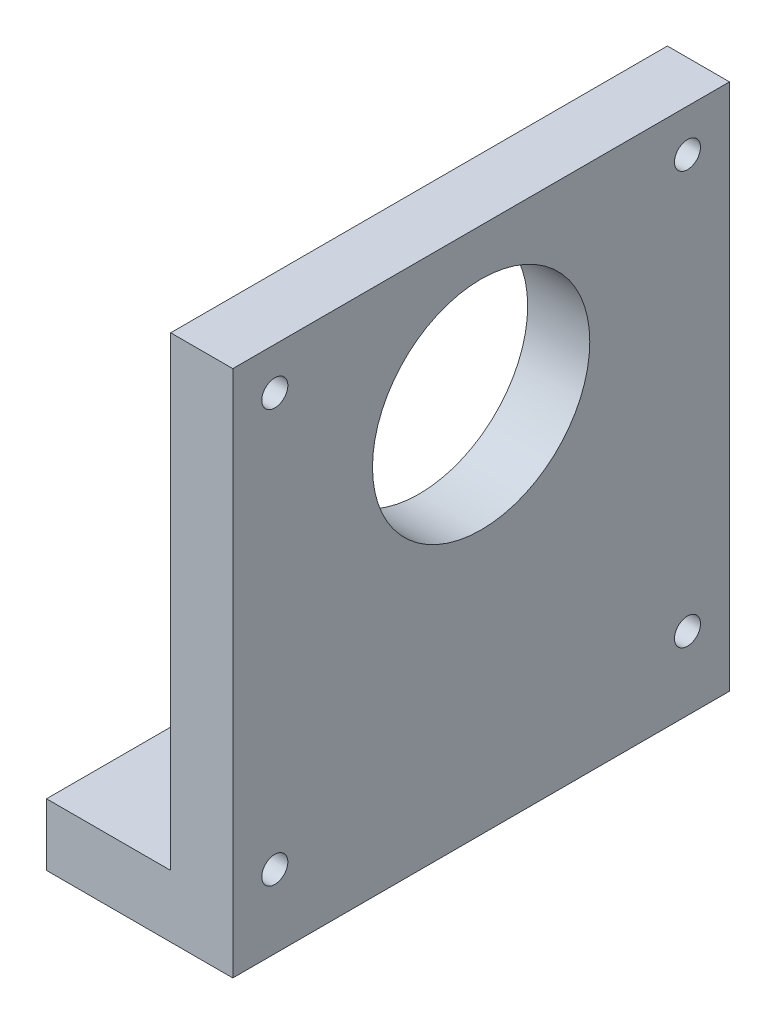
ISO-10303-21;
HEADER;
FILE_DESCRIPTION(('STEP AP214'),'2;1');
FILE_NAME('part.step','',(''),(''),'','','');
FILE_SCHEMA(('AUTOMOTIVE_DESIGN { 1 0 10303 214 1 1 1 1 }'));
ENDSEC;
DATA;
#1=APPLICATION_CONTEXT('core data for automotive mechanical design processes');
#2=APPLICATION_PROTOCOL_DEFINITION('international standard','automotive_design',2000,#1);
#3=PRODUCT_CONTEXT('',#1,'mechanical');
#4=PRODUCT('Part','Part','',(#3));
#5=PRODUCT_RELATED_PRODUCT_CATEGORY('part','',(#4));
#6=PRODUCT_DEFINITION_FORMATION('','',#4);
#7=PRODUCT_DEFINITION_CONTEXT('part definition',#1,'design');
#8=PRODUCT_DEFINITION('design','',#6,#7);
#9=PRODUCT_DEFINITION_SHAPE('','',#8);
#10=(LENGTH_UNIT() NAMED_UNIT(*) SI_UNIT(.MILLI.,.METRE.));
#11=(NAMED_UNIT(*) PLANE_ANGLE_UNIT() SI_UNIT($,.RADIAN.));
#12=(NAMED_UNIT(*) SI_UNIT($,.STERADIAN.) SOLID_ANGLE_UNIT());
#13=UNCERTAINTY_MEASURE_WITH_UNIT(LENGTH_MEASURE(1.E-05),#10,'distance_accuracy_value','');
#14=(GEOMETRIC_REPRESENTATION_CONTEXT(3) GLOBAL_UNCERTAINTY_ASSIGNED_CONTEXT((#13)) GLOBAL_UNIT_ASSIGNED_CONTEXT((#10,
#11,#12)) REPRESENTATION_CONTEXT('',''));
#15=CARTESIAN_POINT('',(0.,0.,0.));
#16=DIRECTION('',(0.,0.,1.));
#17=DIRECTION('',(1.,0.,0.));
#18=AXIS2_PLACEMENT_3D('',#15,#16,#17);
#19=CARTESIAN_POINT('',(0.,10.,40.));
#20=DIRECTION('',(1.,0.,0.));
#21=DIRECTION('',(0.,1.,0.));
#22=AXIS2_PLACEMENT_3D('',#19,#20,#21);
#23=PLANE('',#22);
#24=CARTESIAN_POINT('',(0.,59.9999999999999,0.));
#25=DIRECTION('',(-1.,0.,0.));
#26=DIRECTION('',(0.,-1.,0.));
#27=AXIS2_PLACEMENT_3D('',#24,#25,#26);
#28=CIRCLE('',#27,17.5);
#29=CARTESIAN_POINT('',(0.,42.4999999999999,0.));
#30=VERTEX_POINT('',#29);
#31=EDGE_CURVE('E364',#30,#30,#28,.T.);
#32=ORIENTED_EDGE('',*,*,#31,.F.);
#33=EDGE_LOOP('',(#32));
#34=FACE_BOUND('',#33,.T.);
#35=CARTESIAN_POINT('',(0.,78.2340187157675,33.2340187157679));
#36=DIRECTION('',(-1.,0.,0.));
#37=DIRECTION('',(0.,0.,1.));
#38=AXIS2_PLACEMENT_3D('',#35,#36,#37);
#39=CIRCLE('',#38,2.09999999999999);
#40=CARTESIAN_POINT('',(0.,78.2340187157675,35.3340187157679));
#41=VERTEX_POINT('',#40);
#42=EDGE_CURVE('E360',#41,#41,#39,.T.);
#43=ORIENTED_EDGE('',*,*,#42,.F.);
#44=EDGE_LOOP('',(#43));
#45=FACE_BOUND('',#44,.T.);
#46=CARTESIAN_POINT('',(0.,78.2340187157677,-33.2340187157677));
#47=DIRECTION('',(-1.,0.,0.));
#48=DIRECTION('',(0.,0.,1.));
#49=AXIS2_PLACEMENT_3D('',#46,#47,#48);
#50=CIRCLE('',#49,2.09999999999999);
#51=CARTESIAN_POINT('',(0.,78.2340187157677,-31.1340187157677));
#52=VERTEX_POINT('',#51);
#53=EDGE_CURVE('E354',#52,#52,#50,.T.);
#54=ORIENTED_EDGE('',*,*,#53,.F.);
#55=EDGE_LOOP('',(#54));
#56=FACE_BOUND('',#55,.T.);
#57=DIRECTION('',(0.,0.,-1.));
#58=VECTOR('',#57,1.);
#59=CARTESIAN_POINT('',(0.,10.,40.));
#60=LINE('',#59,#58);
#61=CARTESIAN_POINT('',(0.,10.,-34.3703769795832));
#62=VERTEX_POINT('',#61);
#63=CARTESIAN_POINT('',(0.,10.,-40.));
#64=VERTEX_POINT('',#63);
#65=EDGE_CURVE('E158',#62,#64,#60,.T.);
#66=ORIENTED_EDGE('',*,*,#65,.F.);
#67=CARTESIAN_POINT('',(0.,11.7659812842321,-33.2340187157677));
#68=DIRECTION('',(1.,0.,0.));
#69=DIRECTION('',(0.,1.,0.));
#70=AXIS2_PLACEMENT_3D('',#67,#68,#69);
#71=CIRCLE('',#70,2.09999999999999);
#72=CARTESIAN_POINT('',(0.,10.,-32.0976604519521));
#73=VERTEX_POINT('',#72);
#74=EDGE_CURVE('E11',#62,#73,#71,.T.);
#75=ORIENTED_EDGE('',*,*,#74,.T.);
#76=CARTESIAN_POINT('',(0.,10.,32.0976604519528));
#77=VERTEX_POINT('',#76);
#78=EDGE_CURVE('E169',#77,#73,#60,.T.);
#79=ORIENTED_EDGE('',*,*,#78,.F.);
#80=CARTESIAN_POINT('',(0.,11.7659812842324,33.2340187157679));
#81=DIRECTION('',(-1.,0.,0.));
#82=DIRECTION('',(0.,0.,1.));
#83=AXIS2_PLACEMENT_3D('',#80,#81,#82);
#84=CIRCLE('',#83,2.09999999999999);
#85=CARTESIAN_POINT('',(0.,10.,34.3703769795831));
#86=VERTEX_POINT('',#85);
#87=EDGE_CURVE('E349',#86,#77,#84,.T.);
#88=ORIENTED_EDGE('',*,*,#87,.F.);
#89=CARTESIAN_POINT('',(0.,10.,40.));
#90=VERTEX_POINT('',#89);
#91=EDGE_CURVE('E166',#90,#86,#60,.T.);
#92=ORIENTED_EDGE('',*,*,#91,.F.);
#93=DIRECTION('',(0.,-1.,0.));
#94=VECTOR('',#93,1.);
#95=CARTESIAN_POINT('',(0.,10.,40.));
#96=LINE('',#95,#94);
#97=CARTESIAN_POINT('',(0.,85.,40.));
#98=VERTEX_POINT('',#97);
#99=EDGE_CURVE('E229',#98,#90,#96,.T.);
#100=ORIENTED_EDGE('',*,*,#99,.F.);
#101=DIRECTION('',(0.,0.,-1.));
#102=VECTOR('',#101,1.);
#103=CARTESIAN_POINT('',(0.,85.,40.));
#104=LINE('',#103,#102);
#105=CARTESIAN_POINT('',(0.,85.,-40.));
#106=VERTEX_POINT('',#105);
#107=EDGE_CURVE('E174',#98,#106,#104,.T.);
#108=ORIENTED_EDGE('',*,*,#107,.T.);
#109=DIRECTION('',(0.,-1.,0.));
#110=VECTOR('',#109,1.);
#111=CARTESIAN_POINT('',(0.,10.,-40.));
#112=LINE('',#111,#110);
#113=EDGE_CURVE('E161',#106,#64,#112,.T.);
#114=ORIENTED_EDGE('',*,*,#113,.T.);
#115=EDGE_LOOP('',(#66,#75,#79,#88,#92,#100,#108,#114));
#116=FACE_BOUND('',#115,.T.);
#117=ADVANCED_FACE('F34',(#34,#45,#56,#116),#23,.F.);
#118=CARTESIAN_POINT('',(10.,0.,40.));
#119=DIRECTION('',(-1.,0.,0.));
#120=DIRECTION('',(0.,-1.,0.));
#121=AXIS2_PLACEMENT_3D('',#118,#119,#120);
#122=PLANE('',#121);
#123=CARTESIAN_POINT('',(10.,59.9999999999999,0.));
#124=DIRECTION('',(-1.,0.,0.));
#125=DIRECTION('',(0.,-1.,0.));
#126=AXIS2_PLACEMENT_3D('',#123,#124,#125);
#127=CIRCLE('',#126,17.5);
#128=CARTESIAN_POINT('',(10.,42.4999999999999,0.));
#129=VERTEX_POINT('',#128);
#130=EDGE_CURVE('E363',#129,#129,#127,.T.);
#131=ORIENTED_EDGE('',*,*,#130,.T.);
#132=EDGE_LOOP('',(#131));
#133=FACE_BOUND('',#132,.T.);
#134=CARTESIAN_POINT('',(10.,78.2340187157675,33.2340187157679));
#135=DIRECTION('',(-1.,0.,0.));
#136=DIRECTION('',(0.,-1.,0.));
#137=AXIS2_PLACEMENT_3D('',#134,#135,#136);
#138=CIRCLE('',#137,2.09999999999999);
#139=CARTESIAN_POINT('',(10.,76.1340187157675,33.2340187157679));
#140=VERTEX_POINT('',#139);
#141=EDGE_CURVE('E357',#140,#140,#138,.T.);
#142=ORIENTED_EDGE('',*,*,#141,.T.);
#143=EDGE_LOOP('',(#142));
#144=FACE_BOUND('',#143,.T.);
#145=CARTESIAN_POINT('',(10.,78.2340187157677,-33.2340187157677));
#146=DIRECTION('',(-1.,0.,0.));
#147=DIRECTION('',(0.,-1.,0.));
#148=AXIS2_PLACEMENT_3D('',#145,#146,#147);
#149=CIRCLE('',#148,2.09999999999999);
#150=CARTESIAN_POINT('',(10.,76.1340187157677,-33.2340187157677));
#151=VERTEX_POINT('',#150);
#152=EDGE_CURVE('E155',#151,#151,#149,.T.);
#153=ORIENTED_EDGE('',*,*,#152,.T.);
#154=EDGE_LOOP('',(#153));
#155=FACE_BOUND('',#154,.T.);
#156=CARTESIAN_POINT('',(10.,11.7659812842321,-33.2340187157677));
#157=DIRECTION('',(-1.,0.,0.));
#158=DIRECTION('',(0.,-1.,0.));
#159=AXIS2_PLACEMENT_3D('',#156,#157,#158);
#160=CIRCLE('',#159,2.09999999999999);
#161=CARTESIAN_POINT('',(10.,9.66598128423211,-33.2340187157677));
#162=VERTEX_POINT('',#161);
#163=EDGE_CURVE('E154',#162,#162,#160,.T.);
#164=ORIENTED_EDGE('',*,*,#163,.T.);
#165=EDGE_LOOP('',(#164));
#166=FACE_BOUND('',#165,.T.);
#167=CARTESIAN_POINT('',(10.,11.7659812842324,33.2340187157679));
#168=DIRECTION('',(-1.,0.,0.));
#169=DIRECTION('',(0.,-1.,0.));
#170=AXIS2_PLACEMENT_3D('',#167,#168,#169);
#171=CIRCLE('',#170,2.09999999999999);
#172=CARTESIAN_POINT('',(10.,9.66598128423236,33.2340187157679));
#173=VERTEX_POINT('',#172);
#174=EDGE_CURVE('E345',#173,#173,#171,.T.);
#175=ORIENTED_EDGE('',*,*,#174,.T.);
#176=EDGE_LOOP('',(#175));
#177=FACE_BOUND('',#176,.T.);
#178=DIRECTION('',(0.,1.,0.));
#179=VECTOR('',#178,1.);
#180=CARTESIAN_POINT('',(10.,0.,-40.));
#181=LINE('',#180,#179);
#182=CARTESIAN_POINT('',(10.,0.,-40.));
#183=VERTEX_POINT('',#182);
#184=CARTESIAN_POINT('',(10.,85.,-40.));
#185=VERTEX_POINT('',#184);
#186=EDGE_CURVE('E189',#183,#185,#181,.T.);
#187=ORIENTED_EDGE('',*,*,#186,.T.);
#188=DIRECTION('',(0.,0.,-1.));
#189=VECTOR('',#188,1.);
#190=CARTESIAN_POINT('',(10.,85.,40.));
#191=LINE('',#190,#189);
#192=CARTESIAN_POINT('',(10.,85.,40.));
#193=VERTEX_POINT('',#192);
#194=EDGE_CURVE('E42',#193,#185,#191,.T.);
#195=ORIENTED_EDGE('',*,*,#194,.F.);
#196=DIRECTION('',(0.,1.,0.));
#197=VECTOR('',#196,1.);
#198=CARTESIAN_POINT('',(10.,0.,40.));
#199=LINE('',#198,#197);
#200=CARTESIAN_POINT('',(10.,0.,40.));
#201=VERTEX_POINT('',#200);
#202=EDGE_CURVE('E211',#201,#193,#199,.T.);
#203=ORIENTED_EDGE('',*,*,#202,.F.);
#204=DIRECTION('',(0.,0.,-1.));
#205=VECTOR('',#204,1.);
#206=CARTESIAN_POINT('',(10.,0.,40.));
#207=LINE('',#206,#205);
#208=EDGE_CURVE('E191',#201,#183,#207,.T.);
#209=ORIENTED_EDGE('',*,*,#208,.T.);
#210=EDGE_LOOP('',(#187,#195,#203,#209));
#211=FACE_BOUND('',#210,.T.);
#212=ADVANCED_FACE('F36',(#133,#144,#155,#166,#177,#211),#122,.F.);
#213=CARTESIAN_POINT('',(0.,85.,40.));
#214=DIRECTION('',(0.,-1.,0.));
#215=DIRECTION('',(0.,0.,-1.));
#216=AXIS2_PLACEMENT_3D('',#213,#214,#215);
#217=PLANE('',#216);
#218=DIRECTION('',(-1.,0.,0.));
#219=VECTOR('',#218,1.);
#220=CARTESIAN_POINT('',(0.,85.,-40.));
#221=LINE('',#220,#219);
#222=EDGE_CURVE('E182',#185,#106,#221,.T.);
#223=ORIENTED_EDGE('',*,*,#222,.T.);
#224=ORIENTED_EDGE('',*,*,#107,.F.);
#225=DIRECTION('',(-1.,0.,0.));
#226=VECTOR('',#225,1.);
#227=CARTESIAN_POINT('',(0.,85.,40.));
#228=LINE('',#227,#226);
#229=EDGE_CURVE('E183',#193,#98,#228,.T.);
#230=ORIENTED_EDGE('',*,*,#229,.F.);
#231=ORIENTED_EDGE('',*,*,#194,.T.);
#232=EDGE_LOOP('',(#223,#224,#230,#231));
#233=FACE_BOUND('',#232,.T.);
#234=ADVANCED_FACE('F180',(#233),#217,.F.);
#235=CARTESIAN_POINT('',(0.,10.,40.));
#236=DIRECTION('',(0.,-1.,0.));
#237=DIRECTION('',(1.,0.,0.));
#238=AXIS2_PLACEMENT_3D('',#235,#236,#237);
#239=PLANE('',#238);
#240=DIRECTION('',(0.,0.,1.));
#241=VECTOR('',#240,1.);
#242=CARTESIAN_POINT('',(-13.4999999999996,10.,15.));
#243=LINE('',#242,#241);
#244=CARTESIAN_POINT('',(-13.4999999999996,10.,15.));
#245=VERTEX_POINT('',#244);
#246=CARTESIAN_POINT('',(-13.4999999999996,10.,25.));
#247=VERTEX_POINT('',#246);
#248=EDGE_CURVE('E271',#245,#247,#243,.T.);
#249=ORIENTED_EDGE('',*,*,#248,.F.);
#250=CARTESIAN_POINT('',(-9.99999999999958,10.,15.));
#251=DIRECTION('',(0.,1.,0.));
#252=DIRECTION('',(-1.,0.,0.));
#253=AXIS2_PLACEMENT_3D('',#250,#251,#252);
#254=CIRCLE('',#253,3.5);
#255=CARTESIAN_POINT('',(-6.49999999999958,10.,15.));
#256=VERTEX_POINT('',#255);
#257=EDGE_CURVE('E335',#256,#245,#254,.T.);
#258=ORIENTED_EDGE('',*,*,#257,.F.);
#259=DIRECTION('',(0.,0.,-1.));
#260=VECTOR('',#259,1.);
#261=CARTESIAN_POINT('',(-6.49999999999958,10.,15.));
#262=LINE('',#261,#260);
#263=CARTESIAN_POINT('',(-6.49999999999958,10.,25.));
#264=VERTEX_POINT('',#263);
#265=EDGE_CURVE('E324',#264,#256,#262,.T.);
#266=ORIENTED_EDGE('',*,*,#265,.F.);
#267=CARTESIAN_POINT('',(-9.99999999999958,10.,25.));
#268=DIRECTION('',(0.,1.,0.));
#269=DIRECTION('',(-1.,0.,0.));
#270=AXIS2_PLACEMENT_3D('',#267,#268,#269);
#271=CIRCLE('',#270,3.5);
#272=EDGE_CURVE('E331',#247,#264,#271,.T.);
#273=ORIENTED_EDGE('',*,*,#272,.F.);
#274=EDGE_LOOP('',(#249,#258,#266,#273));
#275=FACE_BOUND('',#274,.T.);
#276=DIRECTION('',(0.,0.,1.));
#277=VECTOR('',#276,1.);
#278=CARTESIAN_POINT('',(-13.5,10.,-25.));
#279=LINE('',#278,#277);
#280=CARTESIAN_POINT('',(-13.5,10.,-25.));
#281=VERTEX_POINT('',#280);
#282=CARTESIAN_POINT('',(-13.5,10.,-15.));
#283=VERTEX_POINT('',#282);
#284=EDGE_CURVE('E276',#281,#283,#279,.T.);
#285=ORIENTED_EDGE('',*,*,#284,.F.);
#286=CARTESIAN_POINT('',(-10.,10.,-25.));
#287=DIRECTION('',(0.,1.,0.));
#288=DIRECTION('',(-1.,0.,0.));
#289=AXIS2_PLACEMENT_3D('',#286,#287,#288);
#290=CIRCLE('',#289,3.5);
#291=CARTESIAN_POINT('',(-6.5,10.,-25.));
#292=VERTEX_POINT('',#291);
#293=EDGE_CURVE('E278',#292,#281,#290,.T.);
#294=ORIENTED_EDGE('',*,*,#293,.F.);
#295=DIRECTION('',(0.,0.,-1.));
#296=VECTOR('',#295,1.);
#297=CARTESIAN_POINT('',(-6.5,10.,-25.));
#298=LINE('',#297,#296);
#299=CARTESIAN_POINT('',(-6.5,10.,-15.));
#300=VERTEX_POINT('',#299);
#301=EDGE_CURVE('E285',#300,#292,#298,.T.);
#302=ORIENTED_EDGE('',*,*,#301,.F.);
#303=CARTESIAN_POINT('',(-10.,10.,-15.));
#304=DIRECTION('',(0.,1.,0.));
#305=DIRECTION('',(-1.,0.,0.));
#306=AXIS2_PLACEMENT_3D('',#303,#304,#305);
#307=CIRCLE('',#306,3.5);
#308=EDGE_CURVE('E280',#283,#300,#307,.T.);
#309=ORIENTED_EDGE('',*,*,#308,.F.);
#310=EDGE_LOOP('',(#285,#294,#302,#309));
#311=FACE_BOUND('',#310,.T.);
#312=DIRECTION('',(-1.,0.,0.));
#313=VECTOR('',#312,1.);
#314=CARTESIAN_POINT('',(0.,10.,-40.));
#315=LINE('',#314,#313);
#316=CARTESIAN_POINT('',(-20.,10.,-40.));
#317=VERTEX_POINT('',#316);
#318=EDGE_CURVE('E205',#64,#317,#315,.T.);
#319=ORIENTED_EDGE('',*,*,#318,.T.);
#320=DIRECTION('',(0.,0.,-1.));
#321=VECTOR('',#320,1.);
#322=CARTESIAN_POINT('',(-20.,10.,40.));
#323=LINE('',#322,#321);
#324=CARTESIAN_POINT('',(-20.,10.,40.));
#325=VERTEX_POINT('',#324);
#326=EDGE_CURVE('E164',#325,#317,#323,.T.);
#327=ORIENTED_EDGE('',*,*,#326,.F.);
#328=DIRECTION('',(-1.,0.,0.));
#329=VECTOR('',#328,1.);
#330=CARTESIAN_POINT('',(0.,10.,40.));
#331=LINE('',#330,#329);
#332=EDGE_CURVE('E234',#90,#325,#331,.T.);
#333=ORIENTED_EDGE('',*,*,#332,.F.);
#334=ORIENTED_EDGE('',*,*,#91,.T.);
#335=EDGE_CURVE('E170',#86,#77,#60,.T.);
#336=ORIENTED_EDGE('',*,*,#335,.T.);
#337=ORIENTED_EDGE('',*,*,#78,.T.);
#338=EDGE_CURVE('E153',#73,#62,#60,.T.);
#339=ORIENTED_EDGE('',*,*,#338,.T.);
#340=ORIENTED_EDGE('',*,*,#65,.T.);
#341=EDGE_LOOP('',(#319,#327,#333,#334,#336,#337,#339,#340));
#342=FACE_BOUND('',#341,.T.);
#343=ADVANCED_FACE('F167',(#275,#311,#342),#239,.F.);
#344=CARTESIAN_POINT('',(-20.,0.,40.));
#345=DIRECTION('',(1.,0.,0.));
#346=DIRECTION('',(0.,0.,-1.));
#347=AXIS2_PLACEMENT_3D('',#344,#345,#346);
#348=PLANE('',#347);
#349=DIRECTION('',(0.,-1.,0.));
#350=VECTOR('',#349,1.);
#351=CARTESIAN_POINT('',(-20.,0.,-40.));
#352=LINE('',#351,#350);
#353=CARTESIAN_POINT('',(-20.,0.,-40.));
#354=VERTEX_POINT('',#353);
#355=EDGE_CURVE('E207',#317,#354,#352,.T.);
#356=ORIENTED_EDGE('',*,*,#355,.T.);
#357=DIRECTION('',(0.,0.,-1.));
#358=VECTOR('',#357,1.);
#359=CARTESIAN_POINT('',(-20.,0.,40.));
#360=LINE('',#359,#358);
#361=CARTESIAN_POINT('',(-20.,0.,40.));
#362=VERTEX_POINT('',#361);
#363=EDGE_CURVE('E212',#362,#354,#360,.T.);
#364=ORIENTED_EDGE('',*,*,#363,.F.);
#365=DIRECTION('',(0.,-1.,0.));
#366=VECTOR('',#365,1.);
#367=CARTESIAN_POINT('',(-20.,0.,40.));
#368=LINE('',#367,#366);
#369=EDGE_CURVE('E223',#325,#362,#368,.T.);
#370=ORIENTED_EDGE('',*,*,#369,.F.);
#371=ORIENTED_EDGE('',*,*,#326,.T.);
#372=EDGE_LOOP('',(#356,#364,#370,#371));
#373=FACE_BOUND('',#372,.T.);
#374=ADVANCED_FACE('F222',(#373),#348,.F.);
#375=CARTESIAN_POINT('',(-20.,0.,40.));
#376=DIRECTION('',(0.,1.,0.));
#377=DIRECTION('',(-1.,0.,0.));
#378=AXIS2_PLACEMENT_3D('',#375,#376,#377);
#379=PLANE('',#378);
#380=DIRECTION('',(0.,0.,1.));
#381=VECTOR('',#380,1.);
#382=CARTESIAN_POINT('',(-6.49999999999958,0.,15.));
#383=LINE('',#382,#381);
#384=CARTESIAN_POINT('',(-6.49999999999958,0.,15.));
#385=VERTEX_POINT('',#384);
#386=CARTESIAN_POINT('',(-6.49999999999958,0.,25.));
#387=VERTEX_POINT('',#386);
#388=EDGE_CURVE('E340',#385,#387,#383,.T.);
#389=ORIENTED_EDGE('',*,*,#388,.F.);
#390=CARTESIAN_POINT('',(-9.99999999999958,0.,15.));
#391=DIRECTION('',(0.,1.,0.));
#392=DIRECTION('',(-1.,0.,0.));
#393=AXIS2_PLACEMENT_3D('',#390,#391,#392);
#394=CIRCLE('',#393,3.5);
#395=CARTESIAN_POINT('',(-13.4999999999996,0.,15.));
#396=VERTEX_POINT('',#395);
#397=EDGE_CURVE('E337',#396,#385,#394,.F.);
#398=ORIENTED_EDGE('',*,*,#397,.F.);
#399=DIRECTION('',(0.,0.,-1.));
#400=VECTOR('',#399,1.);
#401=CARTESIAN_POINT('',(-13.4999999999996,0.,15.));
#402=LINE('',#401,#400);
#403=CARTESIAN_POINT('',(-13.4999999999996,0.,25.));
#404=VERTEX_POINT('',#403);
#405=EDGE_CURVE('E316',#404,#396,#402,.T.);
#406=ORIENTED_EDGE('',*,*,#405,.F.);
#407=CARTESIAN_POINT('',(-9.99999999999958,0.,25.));
#408=DIRECTION('',(0.,1.,0.));
#409=DIRECTION('',(-1.,0.,0.));
#410=AXIS2_PLACEMENT_3D('',#407,#408,#409);
#411=CIRCLE('',#410,3.5);
#412=EDGE_CURVE('E343',#387,#404,#411,.F.);
#413=ORIENTED_EDGE('',*,*,#412,.F.);
#414=EDGE_LOOP('',(#389,#398,#406,#413));
#415=FACE_BOUND('',#414,.T.);
#416=DIRECTION('',(0.,0.,1.));
#417=VECTOR('',#416,1.);
#418=CARTESIAN_POINT('',(-6.5,0.,-25.));
#419=LINE('',#418,#417);
#420=CARTESIAN_POINT('',(-6.5,0.,-25.));
#421=VERTEX_POINT('',#420);
#422=CARTESIAN_POINT('',(-6.5,0.,-15.));
#423=VERTEX_POINT('',#422);
#424=EDGE_CURVE('E307',#421,#423,#419,.T.);
#425=ORIENTED_EDGE('',*,*,#424,.F.);
#426=CARTESIAN_POINT('',(-10.,0.,-25.));
#427=DIRECTION('',(0.,1.,0.));
#428=DIRECTION('',(-1.,0.,0.));
#429=AXIS2_PLACEMENT_3D('',#426,#427,#428);
#430=CIRCLE('',#429,3.5);
#431=CARTESIAN_POINT('',(-13.5,0.,-25.));
#432=VERTEX_POINT('',#431);
#433=EDGE_CURVE('E287',#432,#421,#430,.F.);
#434=ORIENTED_EDGE('',*,*,#433,.F.);
#435=DIRECTION('',(0.,0.,-1.));
#436=VECTOR('',#435,1.);
#437=CARTESIAN_POINT('',(-13.5,0.,-25.));
#438=LINE('',#437,#436);
#439=CARTESIAN_POINT('',(-13.5,0.,-15.));
#440=VERTEX_POINT('',#439);
#441=EDGE_CURVE('E194',#440,#432,#438,.T.);
#442=ORIENTED_EDGE('',*,*,#441,.F.);
#443=CARTESIAN_POINT('',(-10.,0.,-15.));
#444=DIRECTION('',(0.,1.,0.));
#445=DIRECTION('',(-1.,0.,0.));
#446=AXIS2_PLACEMENT_3D('',#443,#444,#445);
#447=CIRCLE('',#446,3.5);
#448=EDGE_CURVE('E311',#423,#440,#447,.F.);
#449=ORIENTED_EDGE('',*,*,#448,.F.);
#450=EDGE_LOOP('',(#425,#434,#442,#449));
#451=FACE_BOUND('',#450,.T.);
#452=DIRECTION('',(1.,0.,0.));
#453=VECTOR('',#452,1.);
#454=CARTESIAN_POINT('',(-20.,0.,-40.));
#455=LINE('',#454,#453);
#456=EDGE_CURVE('E209',#354,#183,#455,.T.);
#457=ORIENTED_EDGE('',*,*,#456,.T.);
#458=ORIENTED_EDGE('',*,*,#208,.F.);
#459=DIRECTION('',(1.,0.,0.));
#460=VECTOR('',#459,1.);
#461=CARTESIAN_POINT('',(-20.,0.,40.));
#462=LINE('',#461,#460);
#463=EDGE_CURVE('E201',#362,#201,#462,.T.);
#464=ORIENTED_EDGE('',*,*,#463,.F.);
#465=ORIENTED_EDGE('',*,*,#363,.T.);
#466=EDGE_LOOP('',(#457,#458,#464,#465));
#467=FACE_BOUND('',#466,.T.);
#468=ADVANCED_FACE('F226',(#415,#451,#467),#379,.F.);
#469=CARTESIAN_POINT('',(10.,85.,40.));
#470=DIRECTION('',(0.,0.,-1.));
#471=DIRECTION('',(-1.,0.,0.));
#472=AXIS2_PLACEMENT_3D('',#469,#470,#471);
#473=PLANE('',#472);
#474=ORIENTED_EDGE('',*,*,#202,.T.);
#475=ORIENTED_EDGE('',*,*,#229,.T.);
#476=ORIENTED_EDGE('',*,*,#99,.T.);
#477=ORIENTED_EDGE('',*,*,#332,.T.);
#478=ORIENTED_EDGE('',*,*,#369,.T.);
#479=ORIENTED_EDGE('',*,*,#463,.T.);
#480=EDGE_LOOP('',(#474,#475,#476,#477,#478,#479));
#481=FACE_BOUND('',#480,.T.);
#482=ADVANCED_FACE('F235',(#481),#473,.F.);
#483=CARTESIAN_POINT('',(10.,85.,-40.));
#484=DIRECTION('',(0.,0.,-1.));
#485=DIRECTION('',(-1.,0.,0.));
#486=AXIS2_PLACEMENT_3D('',#483,#484,#485);
#487=PLANE('',#486);
#488=ORIENTED_EDGE('',*,*,#186,.F.);
#489=ORIENTED_EDGE('',*,*,#456,.F.);
#490=ORIENTED_EDGE('',*,*,#355,.F.);
#491=ORIENTED_EDGE('',*,*,#318,.F.);
#492=ORIENTED_EDGE('',*,*,#113,.F.);
#493=ORIENTED_EDGE('',*,*,#222,.F.);
#494=EDGE_LOOP('',(#488,#489,#490,#491,#492,#493));
#495=FACE_BOUND('',#494,.T.);
#496=ADVANCED_FACE('F225',(#495),#487,.T.);
#497=CARTESIAN_POINT('',(-10.,-0.0010000000000062,-25.));
#498=DIRECTION('',(0.,1.,0.));
#499=DIRECTION('',(-1.,0.,0.));
#500=AXIS2_PLACEMENT_3D('',#497,#498,#499);
#501=CYLINDRICAL_SURFACE('',#500,3.5);
#502=ORIENTED_EDGE('',*,*,#433,.T.);
#503=DIRECTION('',(0.,1.,0.));
#504=VECTOR('',#503,1.);
#505=CARTESIAN_POINT('',(-6.5,-0.0010000000000062,-25.));
#506=LINE('',#505,#504);
#507=EDGE_CURVE('E198',#421,#292,#506,.T.);
#508=ORIENTED_EDGE('',*,*,#507,.T.);
#509=ORIENTED_EDGE('',*,*,#293,.T.);
#510=DIRECTION('',(0.,1.,0.));
#511=VECTOR('',#510,1.);
#512=CARTESIAN_POINT('',(-13.5,-0.0010000000000062,-25.));
#513=LINE('',#512,#511);
#514=EDGE_CURVE('E293',#432,#281,#513,.T.);
#515=ORIENTED_EDGE('',*,*,#514,.F.);
#516=EDGE_LOOP('',(#502,#508,#509,#515));
#517=FACE_BOUND('',#516,.T.);
#518=ADVANCED_FACE('F242',(#517),#501,.F.);
#519=CARTESIAN_POINT('',(-6.5,-0.0010000000000062,-25.));
#520=DIRECTION('',(1.,0.,0.));
#521=DIRECTION('',(0.,1.,0.));
#522=AXIS2_PLACEMENT_3D('',#519,#520,#521);
#523=PLANE('',#522);
#524=ORIENTED_EDGE('',*,*,#424,.T.);
#525=DIRECTION('',(0.,1.,0.));
#526=VECTOR('',#525,1.);
#527=CARTESIAN_POINT('',(-6.5,-0.0010000000000062,-15.));
#528=LINE('',#527,#526);
#529=EDGE_CURVE('E295',#423,#300,#528,.T.);
#530=ORIENTED_EDGE('',*,*,#529,.T.);
#531=ORIENTED_EDGE('',*,*,#301,.T.);
#532=ORIENTED_EDGE('',*,*,#507,.F.);
#533=EDGE_LOOP('',(#524,#530,#531,#532));
#534=FACE_BOUND('',#533,.T.);
#535=ADVANCED_FACE('F306',(#534),#523,.F.);
#536=CARTESIAN_POINT('',(-10.,-0.0010000000000062,-15.));
#537=DIRECTION('',(0.,1.,0.));
#538=DIRECTION('',(-1.,0.,0.));
#539=AXIS2_PLACEMENT_3D('',#536,#537,#538);
#540=CYLINDRICAL_SURFACE('',#539,3.5);
#541=ORIENTED_EDGE('',*,*,#448,.T.);
#542=DIRECTION('',(0.,1.,0.));
#543=VECTOR('',#542,1.);
#544=CARTESIAN_POINT('',(-13.5,-0.0010000000000062,-15.));
#545=LINE('',#544,#543);
#546=EDGE_CURVE('E297',#440,#283,#545,.T.);
#547=ORIENTED_EDGE('',*,*,#546,.T.);
#548=ORIENTED_EDGE('',*,*,#308,.T.);
#549=ORIENTED_EDGE('',*,*,#529,.F.);
#550=EDGE_LOOP('',(#541,#547,#548,#549));
#551=FACE_BOUND('',#550,.T.);
#552=ADVANCED_FACE('F310',(#551),#540,.F.);
#553=CARTESIAN_POINT('',(-13.5,-0.0010000000000062,-25.));
#554=DIRECTION('',(-1.,0.,0.));
#555=DIRECTION('',(0.,-1.,0.));
#556=AXIS2_PLACEMENT_3D('',#553,#554,#555);
#557=PLANE('',#556);
#558=ORIENTED_EDGE('',*,*,#441,.T.);
#559=ORIENTED_EDGE('',*,*,#514,.T.);
#560=ORIENTED_EDGE('',*,*,#284,.T.);
#561=ORIENTED_EDGE('',*,*,#546,.F.);
#562=EDGE_LOOP('',(#558,#559,#560,#561));
#563=FACE_BOUND('',#562,.T.);
#564=ADVANCED_FACE('F298',(#563),#557,.F.);
#565=CARTESIAN_POINT('',(-9.99999999999958,-0.0010000000000062,15.));
#566=DIRECTION('',(0.,1.,0.));
#567=DIRECTION('',(-1.,0.,0.));
#568=AXIS2_PLACEMENT_3D('',#565,#566,#567);
#569=CYLINDRICAL_SURFACE('',#568,3.5);
#570=ORIENTED_EDGE('',*,*,#397,.T.);
#571=DIRECTION('',(0.,1.,0.));
#572=VECTOR('',#571,1.);
#573=CARTESIAN_POINT('',(-6.49999999999958,-0.0010000000000062,15.));
#574=LINE('',#573,#572);
#575=EDGE_CURVE('E319',#385,#256,#574,.T.);
#576=ORIENTED_EDGE('',*,*,#575,.T.);
#577=ORIENTED_EDGE('',*,*,#257,.T.);
#578=DIRECTION('',(0.,1.,0.));
#579=VECTOR('',#578,1.);
#580=CARTESIAN_POINT('',(-13.4999999999996,-0.0010000000000062,15.));
#581=LINE('',#580,#579);
#582=EDGE_CURVE('E320',#396,#245,#581,.T.);
#583=ORIENTED_EDGE('',*,*,#582,.F.);
#584=EDGE_LOOP('',(#570,#576,#577,#583));
#585=FACE_BOUND('',#584,.T.);
#586=ADVANCED_FACE('F402',(#585),#569,.F.);
#587=CARTESIAN_POINT('',(-6.49999999999958,-0.0010000000000062,15.));
#588=DIRECTION('',(1.,0.,0.));
#589=DIRECTION('',(0.,1.,0.));
#590=AXIS2_PLACEMENT_3D('',#587,#588,#589);
#591=PLANE('',#590);
#592=ORIENTED_EDGE('',*,*,#388,.T.);
#593=DIRECTION('',(0.,1.,0.));
#594=VECTOR('',#593,1.);
#595=CARTESIAN_POINT('',(-6.49999999999958,-0.0010000000000062,25.));
#596=LINE('',#595,#594);
#597=EDGE_CURVE('E326',#387,#264,#596,.T.);
#598=ORIENTED_EDGE('',*,*,#597,.T.);
#599=ORIENTED_EDGE('',*,*,#265,.T.);
#600=ORIENTED_EDGE('',*,*,#575,.F.);
#601=EDGE_LOOP('',(#592,#598,#599,#600));
#602=FACE_BOUND('',#601,.T.);
#603=ADVANCED_FACE('F398',(#602),#591,.F.);
#604=CARTESIAN_POINT('',(-9.99999999999958,-0.0010000000000062,25.));
#605=DIRECTION('',(0.,1.,0.));
#606=DIRECTION('',(-1.,0.,0.));
#607=AXIS2_PLACEMENT_3D('',#604,#605,#606);
#608=CYLINDRICAL_SURFACE('',#607,3.5);
#609=ORIENTED_EDGE('',*,*,#412,.T.);
#610=DIRECTION('',(0.,1.,0.));
#611=VECTOR('',#610,1.);
#612=CARTESIAN_POINT('',(-13.4999999999996,-0.0010000000000062,25.));
#613=LINE('',#612,#611);
#614=EDGE_CURVE('E323',#404,#247,#613,.T.);
#615=ORIENTED_EDGE('',*,*,#614,.T.);
#616=ORIENTED_EDGE('',*,*,#272,.T.);
#617=ORIENTED_EDGE('',*,*,#597,.F.);
#618=EDGE_LOOP('',(#609,#615,#616,#617));
#619=FACE_BOUND('',#618,.T.);
#620=ADVANCED_FACE('F401',(#619),#608,.F.);
#621=CARTESIAN_POINT('',(-13.4999999999996,-0.0010000000000062,15.));
#622=DIRECTION('',(-1.,0.,0.));
#623=DIRECTION('',(0.,-1.,0.));
#624=AXIS2_PLACEMENT_3D('',#621,#622,#623);
#625=PLANE('',#624);
#626=ORIENTED_EDGE('',*,*,#405,.T.);
#627=ORIENTED_EDGE('',*,*,#582,.T.);
#628=ORIENTED_EDGE('',*,*,#248,.T.);
#629=ORIENTED_EDGE('',*,*,#614,.F.);
#630=EDGE_LOOP('',(#626,#627,#628,#629));
#631=FACE_BOUND('',#630,.T.);
#632=ADVANCED_FACE('F397',(#631),#625,.F.);
#633=CARTESIAN_POINT('',(0.,13.8659812842323,33.2340187157679));
#634=DIRECTION('',(-1.,0.,0.));
#635=DIRECTION('',(0.,0.,1.));
#636=AXIS2_PLACEMENT_3D('',#633,#634,#635);
#637=PLANE('',#636);
#638=EDGE_CURVE('E55',#77,#86,#84,.T.);
#639=ORIENTED_EDGE('',*,*,#638,.F.);
#640=ORIENTED_EDGE('',*,*,#335,.F.);
#641=EDGE_LOOP('',(#639,#640));
#642=FACE_BOUND('',#641,.T.);
#643=ADVANCED_FACE('F393',(#642),#637,.F.);
#644=CARTESIAN_POINT('',(0.,11.7659812842324,33.2340187157679));
#645=DIRECTION('',(-1.,0.,0.));
#646=DIRECTION('',(0.,0.,1.));
#647=AXIS2_PLACEMENT_3D('',#644,#645,#646);
#648=CYLINDRICAL_SURFACE('',#647,2.09999999999999);
#649=ORIENTED_EDGE('',*,*,#638,.T.);
#650=ORIENTED_EDGE('',*,*,#87,.T.);
#651=EDGE_LOOP('',(#649,#650));
#652=FACE_BOUND('',#651,.T.);
#653=ORIENTED_EDGE('',*,*,#174,.F.);
#654=EDGE_LOOP('',(#653));
#655=FACE_BOUND('',#654,.T.);
#656=ADVANCED_FACE('F390',(#652,#655),#648,.F.);
#657=CARTESIAN_POINT('',(0.,13.8659812842321,-33.2340187157677));
#658=DIRECTION('',(-1.,0.,0.));
#659=DIRECTION('',(0.,0.,1.));
#660=AXIS2_PLACEMENT_3D('',#657,#658,#659);
#661=PLANE('',#660);
#662=CARTESIAN_POINT('',(0.,11.7659812842321,-33.2340187157677));
#663=DIRECTION('',(-1.,0.,0.));
#664=DIRECTION('',(0.,0.,1.));
#665=AXIS2_PLACEMENT_3D('',#662,#663,#664);
#666=CIRCLE('',#665,2.09999999999999);
#667=EDGE_CURVE('E48',#62,#73,#666,.T.);
#668=ORIENTED_EDGE('',*,*,#667,.F.);
#669=ORIENTED_EDGE('',*,*,#338,.F.);
#670=EDGE_LOOP('',(#668,#669));
#671=FACE_BOUND('',#670,.T.);
#672=ADVANCED_FACE('F151',(#671),#661,.F.);
#673=CARTESIAN_POINT('',(0.,11.7659812842321,-33.2340187157677));
#674=DIRECTION('',(-1.,0.,0.));
#675=DIRECTION('',(0.,0.,1.));
#676=AXIS2_PLACEMENT_3D('',#673,#674,#675);
#677=CYLINDRICAL_SURFACE('',#676,2.09999999999999);
#678=ORIENTED_EDGE('',*,*,#667,.T.);
#679=ORIENTED_EDGE('',*,*,#74,.F.);
#680=EDGE_LOOP('',(#678,#679));
#681=FACE_BOUND('',#680,.T.);
#682=ORIENTED_EDGE('',*,*,#163,.F.);
#683=EDGE_LOOP('',(#682));
#684=FACE_BOUND('',#683,.T.);
#685=ADVANCED_FACE('F144',(#681,#684),#677,.F.);
#686=CARTESIAN_POINT('',(0.,78.2340187157677,-33.2340187157677));
#687=DIRECTION('',(-1.,0.,0.));
#688=DIRECTION('',(0.,0.,1.));
#689=AXIS2_PLACEMENT_3D('',#686,#687,#688);
#690=CYLINDRICAL_SURFACE('',#689,2.09999999999999);
#691=ORIENTED_EDGE('',*,*,#53,.T.);
#692=EDGE_LOOP('',(#691));
#693=FACE_BOUND('',#692,.T.);
#694=ORIENTED_EDGE('',*,*,#152,.F.);
#695=EDGE_LOOP('',(#694));
#696=FACE_BOUND('',#695,.T.);
#697=ADVANCED_FACE('F379',(#693,#696),#690,.F.);
#698=CARTESIAN_POINT('',(0.,78.2340187157675,33.2340187157679));
#699=DIRECTION('',(-1.,0.,0.));
#700=DIRECTION('',(0.,0.,1.));
#701=AXIS2_PLACEMENT_3D('',#698,#699,#700);
#702=CYLINDRICAL_SURFACE('',#701,2.09999999999999);
#703=ORIENTED_EDGE('',*,*,#42,.T.);
#704=EDGE_LOOP('',(#703));
#705=FACE_BOUND('',#704,.T.);
#706=ORIENTED_EDGE('',*,*,#141,.F.);
#707=EDGE_LOOP('',(#706));
#708=FACE_BOUND('',#707,.T.);
#709=ADVANCED_FACE('F374',(#705,#708),#702,.F.);
#710=CARTESIAN_POINT('',(10.,59.9999999999999,0.));
#711=DIRECTION('',(-1.,0.,0.));
#712=DIRECTION('',(0.,-1.,0.));
#713=AXIS2_PLACEMENT_3D('',#710,#711,#712);
#714=CYLINDRICAL_SURFACE('',#713,17.5);
#715=ORIENTED_EDGE('',*,*,#130,.F.);
#716=EDGE_LOOP('',(#715));
#717=FACE_BOUND('',#716,.T.);
#718=ORIENTED_EDGE('',*,*,#31,.T.);
#719=EDGE_LOOP('',(#718));
#720=FACE_BOUND('',#719,.T.);
#721=ADVANCED_FACE('F371',(#717,#720),#714,.F.);
#722=CLOSED_SHELL('',(#117,#212,#234,#343,#374,#468,#482,#496,#518,#535,#552,#564,#586,#603,
#620,#632,#643,#656,#672,#685,#697,#709,#721));
#723=MANIFOLD_SOLID_BREP('B2',#722);
#724=ADVANCED_BREP_SHAPE_REPRESENTATION('',(#18,#723),#14);
#725=SHAPE_DEFINITION_REPRESENTATION(#9,#724);
ENDSEC;
END-ISO-10303-21;
